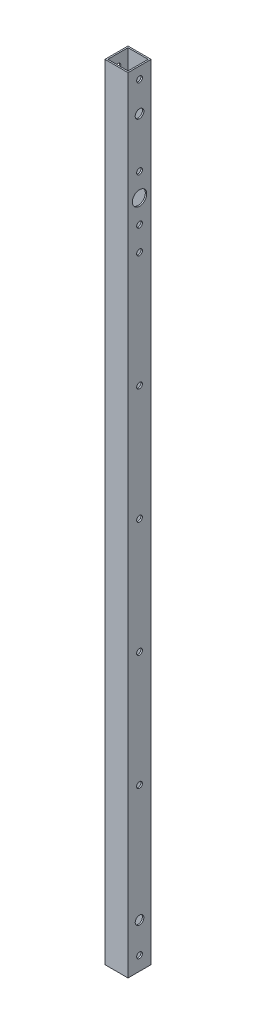
ISO-10303-21;
HEADER;
FILE_DESCRIPTION(('STEP AP214'),'2;1');
FILE_NAME('part.step','',(''),(''),'','','');
FILE_SCHEMA(('AUTOMOTIVE_DESIGN { 1 0 10303 214 1 1 1 1 }'));
ENDSEC;
DATA;
#1=APPLICATION_CONTEXT('core data for automotive mechanical design processes');
#2=APPLICATION_PROTOCOL_DEFINITION('international standard','automotive_design',2000,#1);
#3=PRODUCT_CONTEXT('',#1,'mechanical');
#4=PRODUCT('Part','Part','',(#3));
#5=PRODUCT_RELATED_PRODUCT_CATEGORY('part','',(#4));
#6=PRODUCT_DEFINITION_FORMATION('','',#4);
#7=PRODUCT_DEFINITION_CONTEXT('part definition',#1,'design');
#8=PRODUCT_DEFINITION('design','',#6,#7);
#9=PRODUCT_DEFINITION_SHAPE('','',#8);
#10=(LENGTH_UNIT() NAMED_UNIT(*) SI_UNIT(.MILLI.,.METRE.));
#11=(NAMED_UNIT(*) PLANE_ANGLE_UNIT() SI_UNIT($,.RADIAN.));
#12=(NAMED_UNIT(*) SI_UNIT($,.STERADIAN.) SOLID_ANGLE_UNIT());
#13=UNCERTAINTY_MEASURE_WITH_UNIT(LENGTH_MEASURE(1.E-05),#10,'distance_accuracy_value','');
#14=(GEOMETRIC_REPRESENTATION_CONTEXT(3) GLOBAL_UNCERTAINTY_ASSIGNED_CONTEXT((#13)) GLOBAL_UNIT_ASSIGNED_CONTEXT((#10,
#11,#12)) REPRESENTATION_CONTEXT('',''));
#15=CARTESIAN_POINT('',(0.,0.,0.));
#16=DIRECTION('',(0.,0.,1.));
#17=DIRECTION('',(1.,0.,0.));
#18=AXIS2_PLACEMENT_3D('',#15,#16,#17);
#19=CARTESIAN_POINT('',(0.,863.6,0.));
#20=DIRECTION('',(0.,-1.,0.));
#21=DIRECTION('',(0.,0.,-1.));
#22=AXIS2_PLACEMENT_3D('',#19,#20,#21);
#23=PLANE('',#22);
#24=DIRECTION('',(0.,0.,-1.));
#25=VECTOR('',#24,1.);
#26=CARTESIAN_POINT('',(12.7,863.6,12.7));
#27=LINE('',#26,#25);
#28=CARTESIAN_POINT('',(12.7,863.6,12.7));
#29=VERTEX_POINT('',#28);
#30=CARTESIAN_POINT('',(12.7,863.6,-12.7));
#31=VERTEX_POINT('',#30);
#32=EDGE_CURVE('E156',#29,#31,#27,.T.);
#33=ORIENTED_EDGE('',*,*,#32,.T.);
#34=DIRECTION('',(-1.,0.,0.));
#35=VECTOR('',#34,1.);
#36=CARTESIAN_POINT('',(-12.7,863.6,-12.7));
#37=LINE('',#36,#35);
#38=CARTESIAN_POINT('',(-12.7,863.6,-12.7));
#39=VERTEX_POINT('',#38);
#40=EDGE_CURVE('E160',#31,#39,#37,.T.);
#41=ORIENTED_EDGE('',*,*,#40,.T.);
#42=DIRECTION('',(0.,0.,1.));
#43=VECTOR('',#42,1.);
#44=CARTESIAN_POINT('',(-12.7,863.6,12.7));
#45=LINE('',#44,#43);
#46=CARTESIAN_POINT('',(-12.7,863.6,12.7));
#47=VERTEX_POINT('',#46);
#48=EDGE_CURVE('E164',#39,#47,#45,.T.);
#49=ORIENTED_EDGE('',*,*,#48,.T.);
#50=DIRECTION('',(1.,0.,0.));
#51=VECTOR('',#50,1.);
#52=CARTESIAN_POINT('',(-12.7,863.6,12.7));
#53=LINE('',#52,#51);
#54=EDGE_CURVE('E167',#47,#29,#53,.T.);
#55=ORIENTED_EDGE('',*,*,#54,.T.);
#56=EDGE_LOOP('',(#33,#41,#49,#55));
#57=FACE_BOUND('',#56,.T.);
#58=DIRECTION('',(0.,0.,-1.));
#59=VECTOR('',#58,1.);
#60=CARTESIAN_POINT('',(11.1125,863.6,11.1125));
#61=LINE('',#60,#59);
#62=CARTESIAN_POINT('',(11.1125,863.6,11.1125));
#63=VERTEX_POINT('',#62);
#64=CARTESIAN_POINT('',(11.1125,863.6,-11.1125));
#65=VERTEX_POINT('',#64);
#66=EDGE_CURVE('E106',#63,#65,#61,.T.);
#67=ORIENTED_EDGE('',*,*,#66,.F.);
#68=DIRECTION('',(1.,0.,0.));
#69=VECTOR('',#68,1.);
#70=CARTESIAN_POINT('',(-11.1125,863.6,11.1125));
#71=LINE('',#70,#69);
#72=CARTESIAN_POINT('',(-11.1125,863.6,11.1125));
#73=VERTEX_POINT('',#72);
#74=EDGE_CURVE('E132',#73,#63,#71,.T.);
#75=ORIENTED_EDGE('',*,*,#74,.F.);
#76=DIRECTION('',(0.,0.,1.));
#77=VECTOR('',#76,1.);
#78=CARTESIAN_POINT('',(-11.1125,863.6,11.1125));
#79=LINE('',#78,#77);
#80=CARTESIAN_POINT('',(-11.1125,863.6,-11.1125));
#81=VERTEX_POINT('',#80);
#82=EDGE_CURVE('E128',#81,#73,#79,.T.);
#83=ORIENTED_EDGE('',*,*,#82,.F.);
#84=DIRECTION('',(-1.,0.,0.));
#85=VECTOR('',#84,1.);
#86=CARTESIAN_POINT('',(-11.1125,863.6,-11.1125));
#87=LINE('',#86,#85);
#88=EDGE_CURVE('E115',#65,#81,#87,.T.);
#89=ORIENTED_EDGE('',*,*,#88,.F.);
#90=EDGE_LOOP('',(#67,#75,#83,#89));
#91=FACE_BOUND('',#90,.T.);
#92=ADVANCED_FACE('F38',(#57,#91),#23,.F.);
#93=CARTESIAN_POINT('',(0.,0.,0.));
#94=DIRECTION('',(0.,-1.,0.));
#95=DIRECTION('',(0.,0.,-1.));
#96=AXIS2_PLACEMENT_3D('',#93,#94,#95);
#97=PLANE('',#96);
#98=DIRECTION('',(0.,0.,-1.));
#99=VECTOR('',#98,1.);
#100=CARTESIAN_POINT('',(12.7,0.,12.7));
#101=LINE('',#100,#99);
#102=CARTESIAN_POINT('',(12.7,0.,12.7));
#103=VERTEX_POINT('',#102);
#104=CARTESIAN_POINT('',(12.7,0.,-12.7));
#105=VERTEX_POINT('',#104);
#106=EDGE_CURVE('E124',#103,#105,#101,.T.);
#107=ORIENTED_EDGE('',*,*,#106,.F.);
#108=DIRECTION('',(1.,0.,0.));
#109=VECTOR('',#108,1.);
#110=CARTESIAN_POINT('',(-12.7,0.,12.7));
#111=LINE('',#110,#109);
#112=CARTESIAN_POINT('',(-12.7,0.,12.7));
#113=VERTEX_POINT('',#112);
#114=EDGE_CURVE('E161',#113,#103,#111,.T.);
#115=ORIENTED_EDGE('',*,*,#114,.F.);
#116=DIRECTION('',(0.,0.,1.));
#117=VECTOR('',#116,1.);
#118=CARTESIAN_POINT('',(-12.7,0.,12.7));
#119=LINE('',#118,#117);
#120=CARTESIAN_POINT('',(-12.7,0.,-12.7));
#121=VERTEX_POINT('',#120);
#122=EDGE_CURVE('E177',#121,#113,#119,.T.);
#123=ORIENTED_EDGE('',*,*,#122,.F.);
#124=DIRECTION('',(-1.,0.,0.));
#125=VECTOR('',#124,1.);
#126=CARTESIAN_POINT('',(-12.7,0.,-12.7));
#127=LINE('',#126,#125);
#128=EDGE_CURVE('E174',#105,#121,#127,.T.);
#129=ORIENTED_EDGE('',*,*,#128,.F.);
#130=EDGE_LOOP('',(#107,#115,#123,#129));
#131=FACE_BOUND('',#130,.T.);
#132=DIRECTION('',(1.,0.,0.));
#133=VECTOR('',#132,1.);
#134=CARTESIAN_POINT('',(-11.1125,0.,11.1125));
#135=LINE('',#134,#133);
#136=CARTESIAN_POINT('',(-11.1125,0.,11.1125));
#137=VERTEX_POINT('',#136);
#138=CARTESIAN_POINT('',(11.1125,0.,11.1125));
#139=VERTEX_POINT('',#138);
#140=EDGE_CURVE('E116',#137,#139,#135,.T.);
#141=ORIENTED_EDGE('',*,*,#140,.T.);
#142=DIRECTION('',(0.,0.,-1.));
#143=VECTOR('',#142,1.);
#144=CARTESIAN_POINT('',(11.1125,0.,11.1125));
#145=LINE('',#144,#143);
#146=CARTESIAN_POINT('',(11.1125,0.,-11.1125));
#147=VERTEX_POINT('',#146);
#148=EDGE_CURVE('E64',#139,#147,#145,.T.);
#149=ORIENTED_EDGE('',*,*,#148,.T.);
#150=DIRECTION('',(-1.,0.,0.));
#151=VECTOR('',#150,1.);
#152=CARTESIAN_POINT('',(-11.1125,0.,-11.1125));
#153=LINE('',#152,#151);
#154=CARTESIAN_POINT('',(-11.1125,0.,-11.1125));
#155=VERTEX_POINT('',#154);
#156=EDGE_CURVE('E122',#147,#155,#153,.T.);
#157=ORIENTED_EDGE('',*,*,#156,.T.);
#158=DIRECTION('',(0.,0.,1.));
#159=VECTOR('',#158,1.);
#160=CARTESIAN_POINT('',(-11.1125,0.,11.1125));
#161=LINE('',#160,#159);
#162=EDGE_CURVE('E143',#155,#137,#161,.T.);
#163=ORIENTED_EDGE('',*,*,#162,.T.);
#164=EDGE_LOOP('',(#141,#149,#157,#163));
#165=FACE_BOUND('',#164,.T.);
#166=ADVANCED_FACE('F394',(#131,#165),#97,.T.);
#167=CARTESIAN_POINT('',(12.7,863.6,12.7));
#168=DIRECTION('',(-1.,0.,0.));
#169=DIRECTION('',(0.,0.,1.));
#170=AXIS2_PLACEMENT_3D('',#167,#168,#169);
#171=PLANE('',#170);
#172=CARTESIAN_POINT('',(12.7,763.110800359025,0.));
#173=DIRECTION('',(1.,0.,0.));
#174=DIRECTION('',(0.,0.,-1.));
#175=AXIS2_PLACEMENT_3D('',#172,#173,#174);
#176=CIRCLE('',#175,3.17500000000004);
#177=CARTESIAN_POINT('',(12.7,763.110800359025,-3.17500000000004));
#178=VERTEX_POINT('',#177);
#179=EDGE_CURVE('E502',#178,#178,#176,.T.);
#180=ORIENTED_EDGE('',*,*,#179,.F.);
#181=EDGE_LOOP('',(#180));
#182=FACE_BOUND('',#181,.T.);
#183=CARTESIAN_POINT('',(12.7,712.310800359025,0.));
#184=DIRECTION('',(1.,0.,0.));
#185=DIRECTION('',(0.,0.,-1.));
#186=AXIS2_PLACEMENT_3D('',#183,#184,#185);
#187=CIRCLE('',#186,3.17500000000004);
#188=CARTESIAN_POINT('',(12.7,712.310800359025,-3.17500000000004));
#189=VERTEX_POINT('',#188);
#190=EDGE_CURVE('E246',#189,#189,#187,.T.);
#191=ORIENTED_EDGE('',*,*,#190,.F.);
#192=EDGE_LOOP('',(#191));
#193=FACE_BOUND('',#192,.T.);
#194=CARTESIAN_POINT('',(12.7,737.710800359025,0.));
#195=DIRECTION('',(1.,0.,0.));
#196=DIRECTION('',(0.,0.,-1.));
#197=AXIS2_PLACEMENT_3D('',#194,#195,#196);
#198=CIRCLE('',#197,7.93750000000004);
#199=CARTESIAN_POINT('',(12.7,737.710800359025,-7.93750000000004));
#200=VERTEX_POINT('',#199);
#201=EDGE_CURVE('E243',#200,#200,#198,.T.);
#202=ORIENTED_EDGE('',*,*,#201,.F.);
#203=EDGE_LOOP('',(#202));
#204=FACE_BOUND('',#203,.T.);
#205=CARTESIAN_POINT('',(12.7,818.044974990033,0.));
#206=DIRECTION('',(1.,0.,0.));
#207=DIRECTION('',(0.,0.,-1.));
#208=AXIS2_PLACEMENT_3D('',#205,#206,#207);
#209=CIRCLE('',#208,4.7625);
#210=CARTESIAN_POINT('',(12.7,818.044974990033,-4.7625));
#211=VERTEX_POINT('',#210);
#212=EDGE_CURVE('E265',#211,#211,#209,.T.);
#213=ORIENTED_EDGE('',*,*,#212,.F.);
#214=EDGE_LOOP('',(#213));
#215=FACE_BOUND('',#214,.T.);
#216=CARTESIAN_POINT('',(12.7,48.9005700649443,0.));
#217=DIRECTION('',(1.,0.,0.));
#218=DIRECTION('',(0.,0.,-1.));
#219=AXIS2_PLACEMENT_3D('',#216,#217,#218);
#220=CIRCLE('',#219,4.7625);
#221=CARTESIAN_POINT('',(12.7,48.9005700649443,-4.76249999999999));
#222=VERTEX_POINT('',#221);
#223=EDGE_CURVE('E281',#222,#222,#220,.T.);
#224=ORIENTED_EDGE('',*,*,#223,.F.);
#225=EDGE_LOOP('',(#224));
#226=FACE_BOUND('',#225,.T.);
#227=CARTESIAN_POINT('',(12.7,850.9,0.));
#228=DIRECTION('',(1.,0.,0.));
#229=DIRECTION('',(0.,0.,-1.));
#230=AXIS2_PLACEMENT_3D('',#227,#228,#229);
#231=CIRCLE('',#230,3.17500000000004);
#232=CARTESIAN_POINT('',(12.7,850.9,-3.17500000000004));
#233=VERTEX_POINT('',#232);
#234=EDGE_CURVE('E291',#233,#233,#231,.T.);
#235=ORIENTED_EDGE('',*,*,#234,.F.);
#236=EDGE_LOOP('',(#235));
#237=FACE_BOUND('',#236,.T.);
#238=CARTESIAN_POINT('',(12.7,15.3982824673544,0.));
#239=DIRECTION('',(1.,0.,0.));
#240=DIRECTION('',(0.,0.,-1.));
#241=AXIS2_PLACEMENT_3D('',#238,#239,#240);
#242=CIRCLE('',#241,3.17499999999999);
#243=CARTESIAN_POINT('',(12.7,15.3982824673544,-3.17499999999999));
#244=VERTEX_POINT('',#243);
#245=EDGE_CURVE('E307',#244,#244,#242,.T.);
#246=ORIENTED_EDGE('',*,*,#245,.F.);
#247=EDGE_LOOP('',(#246));
#248=FACE_BOUND('',#247,.T.);
#249=CARTESIAN_POINT('',(12.7,431.8,0.));
#250=DIRECTION('',(1.,0.,0.));
#251=DIRECTION('',(0.,0.,-1.));
#252=AXIS2_PLACEMENT_3D('',#249,#250,#251);
#253=CIRCLE('',#252,3.17499999999998);
#254=CARTESIAN_POINT('',(12.7,431.8,-3.17499999999998));
#255=VERTEX_POINT('',#254);
#256=EDGE_CURVE('E317',#255,#255,#253,.T.);
#257=ORIENTED_EDGE('',*,*,#256,.F.);
#258=EDGE_LOOP('',(#257));
#259=FACE_BOUND('',#258,.T.);
#260=CARTESIAN_POINT('',(12.7,558.8,0.));
#261=DIRECTION('',(1.,0.,0.));
#262=DIRECTION('',(0.,0.,-1.));
#263=AXIS2_PLACEMENT_3D('',#260,#261,#262);
#264=CIRCLE('',#263,3.17500000000004);
#265=CARTESIAN_POINT('',(12.7,558.8,-3.17500000000008));
#266=VERTEX_POINT('',#265);
#267=EDGE_CURVE('E327',#266,#266,#264,.T.);
#268=ORIENTED_EDGE('',*,*,#267,.F.);
#269=EDGE_LOOP('',(#268));
#270=FACE_BOUND('',#269,.T.);
#271=CARTESIAN_POINT('',(12.7,685.8,0.));
#272=DIRECTION('',(1.,0.,0.));
#273=DIRECTION('',(0.,0.,-1.));
#274=AXIS2_PLACEMENT_3D('',#271,#272,#273);
#275=CIRCLE('',#274,3.17500000000004);
#276=CARTESIAN_POINT('',(12.7,685.8,-3.17500000000006));
#277=VERTEX_POINT('',#276);
#278=EDGE_CURVE('E337',#277,#277,#275,.T.);
#279=ORIENTED_EDGE('',*,*,#278,.F.);
#280=EDGE_LOOP('',(#279));
#281=FACE_BOUND('',#280,.T.);
#282=CARTESIAN_POINT('',(12.7,304.8,0.));
#283=DIRECTION('',(1.,0.,0.));
#284=DIRECTION('',(0.,0.,-1.));
#285=AXIS2_PLACEMENT_3D('',#282,#283,#284);
#286=CIRCLE('',#285,3.17499999999998);
#287=CARTESIAN_POINT('',(12.7,304.8,-3.17500000000005));
#288=VERTEX_POINT('',#287);
#289=EDGE_CURVE('E347',#288,#288,#286,.T.);
#290=ORIENTED_EDGE('',*,*,#289,.F.);
#291=EDGE_LOOP('',(#290));
#292=FACE_BOUND('',#291,.T.);
#293=CARTESIAN_POINT('',(12.7,177.8,0.));
#294=DIRECTION('',(1.,0.,0.));
#295=DIRECTION('',(0.,0.,-1.));
#296=AXIS2_PLACEMENT_3D('',#293,#294,#295);
#297=CIRCLE('',#296,3.17499999999998);
#298=CARTESIAN_POINT('',(12.7,177.8,-3.17500000000007));
#299=VERTEX_POINT('',#298);
#300=EDGE_CURVE('E357',#299,#299,#297,.T.);
#301=ORIENTED_EDGE('',*,*,#300,.F.);
#302=EDGE_LOOP('',(#301));
#303=FACE_BOUND('',#302,.T.);
#304=ORIENTED_EDGE('',*,*,#106,.T.);
#305=DIRECTION('',(0.,-1.,0.));
#306=VECTOR('',#305,1.);
#307=CARTESIAN_POINT('',(12.7,863.6,-12.7));
#308=LINE('',#307,#306);
#309=EDGE_CURVE('E11',#31,#105,#308,.T.);
#310=ORIENTED_EDGE('',*,*,#309,.F.);
#311=ORIENTED_EDGE('',*,*,#32,.F.);
#312=DIRECTION('',(0.,-1.,0.));
#313=VECTOR('',#312,1.);
#314=CARTESIAN_POINT('',(12.7,863.6,12.7));
#315=LINE('',#314,#313);
#316=EDGE_CURVE('E170',#29,#103,#315,.T.);
#317=ORIENTED_EDGE('',*,*,#316,.T.);
#318=EDGE_LOOP('',(#304,#310,#311,#317));
#319=FACE_BOUND('',#318,.T.);
#320=ADVANCED_FACE('F40',(#182,#193,#204,#215,#226,#237,#248,#259,#270,#281,#292,#303,#319),
#171,.F.);
#321=CARTESIAN_POINT('',(-12.7,863.6,-12.7));
#322=DIRECTION('',(0.,0.,1.));
#323=DIRECTION('',(1.,0.,0.));
#324=AXIS2_PLACEMENT_3D('',#321,#322,#323);
#325=PLANE('',#324);
#326=ORIENTED_EDGE('',*,*,#128,.T.);
#327=DIRECTION('',(0.,-1.,0.));
#328=VECTOR('',#327,1.);
#329=CARTESIAN_POINT('',(-12.7,863.6,-12.7));
#330=LINE('',#329,#328);
#331=EDGE_CURVE('E48',#39,#121,#330,.T.);
#332=ORIENTED_EDGE('',*,*,#331,.F.);
#333=ORIENTED_EDGE('',*,*,#40,.F.);
#334=ORIENTED_EDGE('',*,*,#309,.T.);
#335=EDGE_LOOP('',(#326,#332,#333,#334));
#336=FACE_BOUND('',#335,.T.);
#337=ADVANCED_FACE('F402',(#336),#325,.F.);
#338=CARTESIAN_POINT('',(-12.7,863.6,12.7));
#339=DIRECTION('',(1.,0.,0.));
#340=DIRECTION('',(0.,0.,-1.));
#341=AXIS2_PLACEMENT_3D('',#338,#339,#340);
#342=PLANE('',#341);
#343=CARTESIAN_POINT('',(-12.7,763.110800359025,0.));
#344=DIRECTION('',(1.,0.,0.));
#345=DIRECTION('',(0.,0.,-1.));
#346=AXIS2_PLACEMENT_3D('',#343,#344,#345);
#347=CIRCLE('',#346,3.17500000000004);
#348=CARTESIAN_POINT('',(-12.7,763.110800359025,-3.17500000000004));
#349=VERTEX_POINT('',#348);
#350=EDGE_CURVE('E504',#349,#349,#347,.T.);
#351=ORIENTED_EDGE('',*,*,#350,.T.);
#352=EDGE_LOOP('',(#351));
#353=FACE_BOUND('',#352,.T.);
#354=CARTESIAN_POINT('',(-12.7,712.310800359025,0.));
#355=DIRECTION('',(1.,0.,0.));
#356=DIRECTION('',(0.,0.,-1.));
#357=AXIS2_PLACEMENT_3D('',#354,#355,#356);
#358=CIRCLE('',#357,3.17500000000004);
#359=CARTESIAN_POINT('',(-12.7,712.310800359025,-3.17500000000004));
#360=VERTEX_POINT('',#359);
#361=EDGE_CURVE('E237',#360,#360,#358,.T.);
#362=ORIENTED_EDGE('',*,*,#361,.T.);
#363=EDGE_LOOP('',(#362));
#364=FACE_BOUND('',#363,.T.);
#365=CARTESIAN_POINT('',(-12.7,737.710800359025,0.));
#366=DIRECTION('',(1.,0.,0.));
#367=DIRECTION('',(0.,0.,-1.));
#368=AXIS2_PLACEMENT_3D('',#365,#366,#367);
#369=CIRCLE('',#368,7.93750000000004);
#370=CARTESIAN_POINT('',(-12.7,737.710800359025,-7.93750000000004));
#371=VERTEX_POINT('',#370);
#372=EDGE_CURVE('E232',#371,#371,#369,.T.);
#373=ORIENTED_EDGE('',*,*,#372,.T.);
#374=EDGE_LOOP('',(#373));
#375=FACE_BOUND('',#374,.T.);
#376=CARTESIAN_POINT('',(-12.7,818.044974990033,0.));
#377=DIRECTION('',(1.,0.,0.));
#378=DIRECTION('',(0.,0.,-1.));
#379=AXIS2_PLACEMENT_3D('',#376,#377,#378);
#380=CIRCLE('',#379,4.7625);
#381=CARTESIAN_POINT('',(-12.7,818.044974990033,-4.7625));
#382=VERTEX_POINT('',#381);
#383=EDGE_CURVE('E269',#382,#382,#380,.T.);
#384=ORIENTED_EDGE('',*,*,#383,.T.);
#385=EDGE_LOOP('',(#384));
#386=FACE_BOUND('',#385,.T.);
#387=CARTESIAN_POINT('',(-12.7,48.9005700649443,0.));
#388=DIRECTION('',(1.,0.,0.));
#389=DIRECTION('',(0.,0.,-1.));
#390=AXIS2_PLACEMENT_3D('',#387,#388,#389);
#391=CIRCLE('',#390,4.7625);
#392=CARTESIAN_POINT('',(-12.7,48.9005700649443,-4.76249999999999));
#393=VERTEX_POINT('',#392);
#394=EDGE_CURVE('E227',#393,#393,#391,.T.);
#395=ORIENTED_EDGE('',*,*,#394,.T.);
#396=EDGE_LOOP('',(#395));
#397=FACE_BOUND('',#396,.T.);
#398=CARTESIAN_POINT('',(-12.7,850.9,0.));
#399=DIRECTION('',(1.,0.,0.));
#400=DIRECTION('',(0.,0.,-1.));
#401=AXIS2_PLACEMENT_3D('',#398,#399,#400);
#402=CIRCLE('',#401,3.17500000000004);
#403=CARTESIAN_POINT('',(-12.7,850.9,-3.17500000000004));
#404=VERTEX_POINT('',#403);
#405=EDGE_CURVE('E295',#404,#404,#402,.T.);
#406=ORIENTED_EDGE('',*,*,#405,.T.);
#407=EDGE_LOOP('',(#406));
#408=FACE_BOUND('',#407,.T.);
#409=CARTESIAN_POINT('',(-12.7,15.3982824673544,0.));
#410=DIRECTION('',(1.,0.,0.));
#411=DIRECTION('',(0.,0.,-1.));
#412=AXIS2_PLACEMENT_3D('',#409,#410,#411);
#413=CIRCLE('',#412,3.17499999999999);
#414=CARTESIAN_POINT('',(-12.7,15.3982824673544,-3.17499999999998));
#415=VERTEX_POINT('',#414);
#416=EDGE_CURVE('E221',#415,#415,#413,.T.);
#417=ORIENTED_EDGE('',*,*,#416,.T.);
#418=EDGE_LOOP('',(#417));
#419=FACE_BOUND('',#418,.T.);
#420=CARTESIAN_POINT('',(-12.7,431.8,0.));
#421=DIRECTION('',(1.,0.,0.));
#422=DIRECTION('',(0.,0.,-1.));
#423=AXIS2_PLACEMENT_3D('',#420,#421,#422);
#424=CIRCLE('',#423,3.17499999999998);
#425=CARTESIAN_POINT('',(-12.7,431.8,-3.17499999999998));
#426=VERTEX_POINT('',#425);
#427=EDGE_CURVE('E215',#426,#426,#424,.T.);
#428=ORIENTED_EDGE('',*,*,#427,.T.);
#429=EDGE_LOOP('',(#428));
#430=FACE_BOUND('',#429,.T.);
#431=CARTESIAN_POINT('',(-12.7,558.8,0.));
#432=DIRECTION('',(1.,0.,0.));
#433=DIRECTION('',(0.,0.,-1.));
#434=AXIS2_PLACEMENT_3D('',#431,#432,#433);
#435=CIRCLE('',#434,3.17500000000004);
#436=CARTESIAN_POINT('',(-12.7,558.8,-3.17500000000007));
#437=VERTEX_POINT('',#436);
#438=EDGE_CURVE('E209',#437,#437,#435,.T.);
#439=ORIENTED_EDGE('',*,*,#438,.T.);
#440=EDGE_LOOP('',(#439));
#441=FACE_BOUND('',#440,.T.);
#442=CARTESIAN_POINT('',(-12.7,685.8,0.));
#443=DIRECTION('',(1.,0.,0.));
#444=DIRECTION('',(0.,0.,-1.));
#445=AXIS2_PLACEMENT_3D('',#442,#443,#444);
#446=CIRCLE('',#445,3.17500000000004);
#447=CARTESIAN_POINT('',(-12.7,685.8,-3.17500000000006));
#448=VERTEX_POINT('',#447);
#449=EDGE_CURVE('E203',#448,#448,#446,.T.);
#450=ORIENTED_EDGE('',*,*,#449,.T.);
#451=EDGE_LOOP('',(#450));
#452=FACE_BOUND('',#451,.T.);
#453=CARTESIAN_POINT('',(-12.7,304.8,0.));
#454=DIRECTION('',(1.,0.,0.));
#455=DIRECTION('',(0.,0.,-1.));
#456=AXIS2_PLACEMENT_3D('',#453,#454,#455);
#457=CIRCLE('',#456,3.17499999999998);
#458=CARTESIAN_POINT('',(-12.7,304.8,-3.17500000000005));
#459=VERTEX_POINT('',#458);
#460=EDGE_CURVE('E197',#459,#459,#457,.T.);
#461=ORIENTED_EDGE('',*,*,#460,.T.);
#462=EDGE_LOOP('',(#461));
#463=FACE_BOUND('',#462,.T.);
#464=CARTESIAN_POINT('',(-12.7,177.8,0.));
#465=DIRECTION('',(1.,0.,0.));
#466=DIRECTION('',(0.,0.,-1.));
#467=AXIS2_PLACEMENT_3D('',#464,#465,#466);
#468=CIRCLE('',#467,3.17499999999998);
#469=CARTESIAN_POINT('',(-12.7,177.8,-3.17500000000007));
#470=VERTEX_POINT('',#469);
#471=EDGE_CURVE('E361',#470,#470,#468,.T.);
#472=ORIENTED_EDGE('',*,*,#471,.T.);
#473=EDGE_LOOP('',(#472));
#474=FACE_BOUND('',#473,.T.);
#475=ORIENTED_EDGE('',*,*,#122,.T.);
#476=DIRECTION('',(0.,-1.,0.));
#477=VECTOR('',#476,1.);
#478=CARTESIAN_POINT('',(-12.7,863.6,12.7));
#479=LINE('',#478,#477);
#480=EDGE_CURVE('E185',#47,#113,#479,.T.);
#481=ORIENTED_EDGE('',*,*,#480,.F.);
#482=ORIENTED_EDGE('',*,*,#48,.F.);
#483=ORIENTED_EDGE('',*,*,#331,.T.);
#484=EDGE_LOOP('',(#475,#481,#482,#483));
#485=FACE_BOUND('',#484,.T.);
#486=ADVANCED_FACE('F387',(#353,#364,#375,#386,#397,#408,#419,#430,#441,#452,#463,#474,#485),
#342,.F.);
#487=CARTESIAN_POINT('',(-12.7,863.6,12.7));
#488=DIRECTION('',(0.,0.,-1.));
#489=DIRECTION('',(-1.,0.,0.));
#490=AXIS2_PLACEMENT_3D('',#487,#488,#489);
#491=PLANE('',#490);
#492=ORIENTED_EDGE('',*,*,#114,.T.);
#493=ORIENTED_EDGE('',*,*,#316,.F.);
#494=ORIENTED_EDGE('',*,*,#54,.F.);
#495=ORIENTED_EDGE('',*,*,#480,.T.);
#496=EDGE_LOOP('',(#492,#493,#494,#495));
#497=FACE_BOUND('',#496,.T.);
#498=ADVANCED_FACE('F376',(#497),#491,.F.);
#499=CARTESIAN_POINT('',(11.1125,863.6,11.1125));
#500=DIRECTION('',(-1.,0.,0.));
#501=DIRECTION('',(0.,0.,1.));
#502=AXIS2_PLACEMENT_3D('',#499,#500,#501);
#503=PLANE('',#502);
#504=CARTESIAN_POINT('',(11.1125,763.110800359025,0.));
#505=DIRECTION('',(-1.,0.,0.));
#506=DIRECTION('',(0.,0.,1.));
#507=AXIS2_PLACEMENT_3D('',#504,#505,#506);
#508=CIRCLE('',#507,3.17500000000004);
#509=CARTESIAN_POINT('',(11.1125,763.110800359025,3.17500000000004));
#510=VERTEX_POINT('',#509);
#511=EDGE_CURVE('E42',#510,#510,#508,.T.);
#512=ORIENTED_EDGE('',*,*,#511,.F.);
#513=EDGE_LOOP('',(#512));
#514=FACE_BOUND('',#513,.T.);
#515=CARTESIAN_POINT('',(11.1125,712.310800359025,0.));
#516=DIRECTION('',(-1.,0.,0.));
#517=DIRECTION('',(0.,0.,1.));
#518=AXIS2_PLACEMENT_3D('',#515,#516,#517);
#519=CIRCLE('',#518,3.17500000000004);
#520=CARTESIAN_POINT('',(11.1125,712.310800359025,3.17500000000004));
#521=VERTEX_POINT('',#520);
#522=EDGE_CURVE('E233',#521,#521,#519,.T.);
#523=ORIENTED_EDGE('',*,*,#522,.F.);
#524=EDGE_LOOP('',(#523));
#525=FACE_BOUND('',#524,.T.);
#526=CARTESIAN_POINT('',(11.1125,737.710800359025,0.));
#527=DIRECTION('',(-1.,0.,0.));
#528=DIRECTION('',(0.,0.,1.));
#529=AXIS2_PLACEMENT_3D('',#526,#527,#528);
#530=CIRCLE('',#529,7.93750000000004);
#531=CARTESIAN_POINT('',(11.1125,737.710800359025,7.93750000000004));
#532=VERTEX_POINT('',#531);
#533=EDGE_CURVE('E228',#532,#532,#530,.T.);
#534=ORIENTED_EDGE('',*,*,#533,.F.);
#535=EDGE_LOOP('',(#534));
#536=FACE_BOUND('',#535,.T.);
#537=CARTESIAN_POINT('',(11.1125,818.044974990033,0.));
#538=DIRECTION('',(-1.,0.,0.));
#539=DIRECTION('',(0.,0.,1.));
#540=AXIS2_PLACEMENT_3D('',#537,#538,#539);
#541=CIRCLE('',#540,4.7625);
#542=CARTESIAN_POINT('',(11.1125,818.044974990033,4.7625));
#543=VERTEX_POINT('',#542);
#544=EDGE_CURVE('E273',#543,#543,#541,.T.);
#545=ORIENTED_EDGE('',*,*,#544,.F.);
#546=EDGE_LOOP('',(#545));
#547=FACE_BOUND('',#546,.T.);
#548=CARTESIAN_POINT('',(11.1125,48.9005700649443,0.));
#549=DIRECTION('',(-1.,0.,0.));
#550=DIRECTION('',(0.,0.,1.));
#551=AXIS2_PLACEMENT_3D('',#548,#549,#550);
#552=CIRCLE('',#551,4.7625);
#553=CARTESIAN_POINT('',(11.1125,48.9005700649443,4.7625));
#554=VERTEX_POINT('',#553);
#555=EDGE_CURVE('E226',#554,#554,#552,.T.);
#556=ORIENTED_EDGE('',*,*,#555,.F.);
#557=EDGE_LOOP('',(#556));
#558=FACE_BOUND('',#557,.T.);
#559=CARTESIAN_POINT('',(11.1125,850.9,0.));
#560=DIRECTION('',(-1.,0.,0.));
#561=DIRECTION('',(0.,0.,1.));
#562=AXIS2_PLACEMENT_3D('',#559,#560,#561);
#563=CIRCLE('',#562,3.17500000000004);
#564=CARTESIAN_POINT('',(11.1125,850.9,3.17500000000004));
#565=VERTEX_POINT('',#564);
#566=EDGE_CURVE('E299',#565,#565,#563,.T.);
#567=ORIENTED_EDGE('',*,*,#566,.F.);
#568=EDGE_LOOP('',(#567));
#569=FACE_BOUND('',#568,.T.);
#570=CARTESIAN_POINT('',(11.1125,15.3982824673544,0.));
#571=DIRECTION('',(-1.,0.,0.));
#572=DIRECTION('',(0.,0.,1.));
#573=AXIS2_PLACEMENT_3D('',#570,#571,#572);
#574=CIRCLE('',#573,3.17499999999999);
#575=CARTESIAN_POINT('',(11.1125,15.3982824673544,3.17499999999999));
#576=VERTEX_POINT('',#575);
#577=EDGE_CURVE('E220',#576,#576,#574,.T.);
#578=ORIENTED_EDGE('',*,*,#577,.F.);
#579=EDGE_LOOP('',(#578));
#580=FACE_BOUND('',#579,.T.);
#581=CARTESIAN_POINT('',(11.1125,431.8,0.));
#582=DIRECTION('',(-1.,0.,0.));
#583=DIRECTION('',(0.,0.,1.));
#584=AXIS2_PLACEMENT_3D('',#581,#582,#583);
#585=CIRCLE('',#584,3.17499999999998);
#586=CARTESIAN_POINT('',(11.1125,431.8,3.17499999999998));
#587=VERTEX_POINT('',#586);
#588=EDGE_CURVE('E214',#587,#587,#585,.T.);
#589=ORIENTED_EDGE('',*,*,#588,.F.);
#590=EDGE_LOOP('',(#589));
#591=FACE_BOUND('',#590,.T.);
#592=CARTESIAN_POINT('',(11.1125,558.8,0.));
#593=DIRECTION('',(-1.,0.,0.));
#594=DIRECTION('',(0.,0.,1.));
#595=AXIS2_PLACEMENT_3D('',#592,#593,#594);
#596=CIRCLE('',#595,3.17500000000004);
#597=CARTESIAN_POINT('',(11.1125,558.8,3.175));
#598=VERTEX_POINT('',#597);
#599=EDGE_CURVE('E204',#598,#598,#596,.T.);
#600=ORIENTED_EDGE('',*,*,#599,.F.);
#601=EDGE_LOOP('',(#600));
#602=FACE_BOUND('',#601,.T.);
#603=CARTESIAN_POINT('',(11.1125,685.8,0.));
#604=DIRECTION('',(-1.,0.,0.));
#605=DIRECTION('',(0.,0.,1.));
#606=AXIS2_PLACEMENT_3D('',#603,#604,#605);
#607=CIRCLE('',#606,3.17500000000004);
#608=CARTESIAN_POINT('',(11.1125,685.8,3.17500000000002));
#609=VERTEX_POINT('',#608);
#610=EDGE_CURVE('E202',#609,#609,#607,.T.);
#611=ORIENTED_EDGE('',*,*,#610,.F.);
#612=EDGE_LOOP('',(#611));
#613=FACE_BOUND('',#612,.T.);
#614=CARTESIAN_POINT('',(11.1125,304.8,0.));
#615=DIRECTION('',(-1.,0.,0.));
#616=DIRECTION('',(0.,0.,1.));
#617=AXIS2_PLACEMENT_3D('',#614,#615,#616);
#618=CIRCLE('',#617,3.17499999999998);
#619=CARTESIAN_POINT('',(11.1125,304.8,3.17499999999991));
#620=VERTEX_POINT('',#619);
#621=EDGE_CURVE('E196',#620,#620,#618,.T.);
#622=ORIENTED_EDGE('',*,*,#621,.F.);
#623=EDGE_LOOP('',(#622));
#624=FACE_BOUND('',#623,.T.);
#625=CARTESIAN_POINT('',(11.1125,177.8,0.));
#626=DIRECTION('',(-1.,0.,0.));
#627=DIRECTION('',(0.,0.,1.));
#628=AXIS2_PLACEMENT_3D('',#625,#626,#627);
#629=CIRCLE('',#628,3.17499999999998);
#630=CARTESIAN_POINT('',(11.1125,177.8,3.1749999999999));
#631=VERTEX_POINT('',#630);
#632=EDGE_CURVE('E140',#631,#631,#629,.T.);
#633=ORIENTED_EDGE('',*,*,#632,.F.);
#634=EDGE_LOOP('',(#633));
#635=FACE_BOUND('',#634,.T.);
#636=ORIENTED_EDGE('',*,*,#148,.F.);
#637=DIRECTION('',(0.,-1.,0.));
#638=VECTOR('',#637,1.);
#639=CARTESIAN_POINT('',(11.1125,863.6,11.1125));
#640=LINE('',#639,#638);
#641=EDGE_CURVE('E110',#63,#139,#640,.T.);
#642=ORIENTED_EDGE('',*,*,#641,.F.);
#643=ORIENTED_EDGE('',*,*,#66,.T.);
#644=DIRECTION('',(0.,-1.,0.));
#645=VECTOR('',#644,1.);
#646=CARTESIAN_POINT('',(11.1125,863.6,-11.1125));
#647=LINE('',#646,#645);
#648=EDGE_CURVE('E109',#65,#147,#647,.T.);
#649=ORIENTED_EDGE('',*,*,#648,.T.);
#650=EDGE_LOOP('',(#636,#642,#643,#649));
#651=FACE_BOUND('',#650,.T.);
#652=ADVANCED_FACE('F108',(#514,#525,#536,#547,#558,#569,#580,#591,#602,#613,#624,#635,#651),
#503,.T.);
#653=CARTESIAN_POINT('',(-11.1125,863.6,-11.1125));
#654=DIRECTION('',(0.,0.,1.));
#655=DIRECTION('',(1.,0.,0.));
#656=AXIS2_PLACEMENT_3D('',#653,#654,#655);
#657=PLANE('',#656);
#658=ORIENTED_EDGE('',*,*,#156,.F.);
#659=ORIENTED_EDGE('',*,*,#648,.F.);
#660=ORIENTED_EDGE('',*,*,#88,.T.);
#661=DIRECTION('',(0.,-1.,0.));
#662=VECTOR('',#661,1.);
#663=CARTESIAN_POINT('',(-11.1125,863.6,-11.1125));
#664=LINE('',#663,#662);
#665=EDGE_CURVE('E125',#81,#155,#664,.T.);
#666=ORIENTED_EDGE('',*,*,#665,.T.);
#667=EDGE_LOOP('',(#658,#659,#660,#666));
#668=FACE_BOUND('',#667,.T.);
#669=ADVANCED_FACE('F119',(#668),#657,.T.);
#670=CARTESIAN_POINT('',(-11.1125,863.6,11.1125));
#671=DIRECTION('',(1.,0.,0.));
#672=DIRECTION('',(0.,0.,-1.));
#673=AXIS2_PLACEMENT_3D('',#670,#671,#672);
#674=PLANE('',#673);
#675=CARTESIAN_POINT('',(-11.1125,763.110800359025,0.));
#676=DIRECTION('',(1.,0.,0.));
#677=DIRECTION('',(0.,0.,-1.));
#678=AXIS2_PLACEMENT_3D('',#675,#676,#677);
#679=CIRCLE('',#678,3.17500000000004);
#680=CARTESIAN_POINT('',(-11.1125,763.110800359025,-3.17500000000004));
#681=VERTEX_POINT('',#680);
#682=EDGE_CURVE('E252',#681,#681,#679,.T.);
#683=ORIENTED_EDGE('',*,*,#682,.F.);
#684=EDGE_LOOP('',(#683));
#685=FACE_BOUND('',#684,.T.);
#686=CARTESIAN_POINT('',(-11.1125,712.310800359025,0.));
#687=DIRECTION('',(1.,0.,0.));
#688=DIRECTION('',(0.,0.,-1.));
#689=AXIS2_PLACEMENT_3D('',#686,#687,#688);
#690=CIRCLE('',#689,3.17500000000004);
#691=CARTESIAN_POINT('',(-11.1125,712.310800359025,-3.17500000000004));
#692=VERTEX_POINT('',#691);
#693=EDGE_CURVE('E236',#692,#692,#690,.T.);
#694=ORIENTED_EDGE('',*,*,#693,.F.);
#695=EDGE_LOOP('',(#694));
#696=FACE_BOUND('',#695,.T.);
#697=CARTESIAN_POINT('',(-11.1125,737.710800359025,0.));
#698=DIRECTION('',(1.,0.,0.));
#699=DIRECTION('',(0.,0.,-1.));
#700=AXIS2_PLACEMENT_3D('',#697,#698,#699);
#701=CIRCLE('',#700,7.93750000000004);
#702=CARTESIAN_POINT('',(-11.1125,737.710800359025,-7.93750000000004));
#703=VERTEX_POINT('',#702);
#704=EDGE_CURVE('E231',#703,#703,#701,.T.);
#705=ORIENTED_EDGE('',*,*,#704,.F.);
#706=EDGE_LOOP('',(#705));
#707=FACE_BOUND('',#706,.T.);
#708=CARTESIAN_POINT('',(-11.1125,818.044974990033,0.));
#709=DIRECTION('',(1.,0.,0.));
#710=DIRECTION('',(0.,0.,-1.));
#711=AXIS2_PLACEMENT_3D('',#708,#709,#710);
#712=CIRCLE('',#711,4.7625);
#713=CARTESIAN_POINT('',(-11.1125,818.044974990033,-4.7625));
#714=VERTEX_POINT('',#713);
#715=EDGE_CURVE('E277',#714,#714,#712,.T.);
#716=ORIENTED_EDGE('',*,*,#715,.F.);
#717=EDGE_LOOP('',(#716));
#718=FACE_BOUND('',#717,.T.);
#719=CARTESIAN_POINT('',(-11.1125,48.9005700649443,0.));
#720=DIRECTION('',(1.,0.,0.));
#721=DIRECTION('',(0.,0.,-1.));
#722=AXIS2_PLACEMENT_3D('',#719,#720,#721);
#723=CIRCLE('',#722,4.7625);
#724=CARTESIAN_POINT('',(-11.1125,48.9005700649443,-4.76249999999999));
#725=VERTEX_POINT('',#724);
#726=EDGE_CURVE('E222',#725,#725,#723,.T.);
#727=ORIENTED_EDGE('',*,*,#726,.F.);
#728=EDGE_LOOP('',(#727));
#729=FACE_BOUND('',#728,.T.);
#730=CARTESIAN_POINT('',(-11.1125,850.9,0.));
#731=DIRECTION('',(1.,0.,0.));
#732=DIRECTION('',(0.,0.,-1.));
#733=AXIS2_PLACEMENT_3D('',#730,#731,#732);
#734=CIRCLE('',#733,3.17500000000004);
#735=CARTESIAN_POINT('',(-11.1125,850.9,-3.17500000000004));
#736=VERTEX_POINT('',#735);
#737=EDGE_CURVE('E303',#736,#736,#734,.T.);
#738=ORIENTED_EDGE('',*,*,#737,.F.);
#739=EDGE_LOOP('',(#738));
#740=FACE_BOUND('',#739,.T.);
#741=CARTESIAN_POINT('',(-11.1125,15.3982824673544,0.));
#742=DIRECTION('',(1.,0.,0.));
#743=DIRECTION('',(0.,0.,-1.));
#744=AXIS2_PLACEMENT_3D('',#741,#742,#743);
#745=CIRCLE('',#744,3.17499999999999);
#746=CARTESIAN_POINT('',(-11.1125,15.3982824673544,-3.17499999999998));
#747=VERTEX_POINT('',#746);
#748=EDGE_CURVE('E216',#747,#747,#745,.T.);
#749=ORIENTED_EDGE('',*,*,#748,.F.);
#750=EDGE_LOOP('',(#749));
#751=FACE_BOUND('',#750,.T.);
#752=CARTESIAN_POINT('',(-11.1125,431.8,0.));
#753=DIRECTION('',(1.,0.,0.));
#754=DIRECTION('',(0.,0.,-1.));
#755=AXIS2_PLACEMENT_3D('',#752,#753,#754);
#756=CIRCLE('',#755,3.17499999999998);
#757=CARTESIAN_POINT('',(-11.1125,431.8,-3.17499999999998));
#758=VERTEX_POINT('',#757);
#759=EDGE_CURVE('E210',#758,#758,#756,.T.);
#760=ORIENTED_EDGE('',*,*,#759,.F.);
#761=EDGE_LOOP('',(#760));
#762=FACE_BOUND('',#761,.T.);
#763=CARTESIAN_POINT('',(-11.1125,558.8,0.));
#764=DIRECTION('',(1.,0.,0.));
#765=DIRECTION('',(0.,0.,-1.));
#766=AXIS2_PLACEMENT_3D('',#763,#764,#765);
#767=CIRCLE('',#766,3.17500000000004);
#768=CARTESIAN_POINT('',(-11.1125,558.8,-3.17500000000007));
#769=VERTEX_POINT('',#768);
#770=EDGE_CURVE('E208',#769,#769,#767,.T.);
#771=ORIENTED_EDGE('',*,*,#770,.F.);
#772=EDGE_LOOP('',(#771));
#773=FACE_BOUND('',#772,.T.);
#774=CARTESIAN_POINT('',(-11.1125,685.8,0.));
#775=DIRECTION('',(1.,0.,0.));
#776=DIRECTION('',(0.,0.,-1.));
#777=AXIS2_PLACEMENT_3D('',#774,#775,#776);
#778=CIRCLE('',#777,3.17500000000004);
#779=CARTESIAN_POINT('',(-11.1125,685.8,-3.17500000000006));
#780=VERTEX_POINT('',#779);
#781=EDGE_CURVE('E198',#780,#780,#778,.T.);
#782=ORIENTED_EDGE('',*,*,#781,.F.);
#783=EDGE_LOOP('',(#782));
#784=FACE_BOUND('',#783,.T.);
#785=CARTESIAN_POINT('',(-11.1125,304.8,0.));
#786=DIRECTION('',(1.,0.,0.));
#787=DIRECTION('',(0.,0.,-1.));
#788=AXIS2_PLACEMENT_3D('',#785,#786,#787);
#789=CIRCLE('',#788,3.17499999999998);
#790=CARTESIAN_POINT('',(-11.1125,304.8,-3.17500000000005));
#791=VERTEX_POINT('',#790);
#792=EDGE_CURVE('E192',#791,#791,#789,.T.);
#793=ORIENTED_EDGE('',*,*,#792,.F.);
#794=EDGE_LOOP('',(#793));
#795=FACE_BOUND('',#794,.T.);
#796=CARTESIAN_POINT('',(-11.1125,177.8,0.));
#797=DIRECTION('',(1.,0.,0.));
#798=DIRECTION('',(0.,0.,-1.));
#799=AXIS2_PLACEMENT_3D('',#796,#797,#798);
#800=CIRCLE('',#799,3.17499999999998);
#801=CARTESIAN_POINT('',(-11.1125,177.8,-3.17500000000007));
#802=VERTEX_POINT('',#801);
#803=EDGE_CURVE('E365',#802,#802,#800,.T.);
#804=ORIENTED_EDGE('',*,*,#803,.F.);
#805=EDGE_LOOP('',(#804));
#806=FACE_BOUND('',#805,.T.);
#807=ORIENTED_EDGE('',*,*,#162,.F.);
#808=ORIENTED_EDGE('',*,*,#665,.F.);
#809=ORIENTED_EDGE('',*,*,#82,.T.);
#810=DIRECTION('',(0.,-1.,0.));
#811=VECTOR('',#810,1.);
#812=CARTESIAN_POINT('',(-11.1125,863.6,11.1125));
#813=LINE('',#812,#811);
#814=EDGE_CURVE('E56',#73,#137,#813,.T.);
#815=ORIENTED_EDGE('',*,*,#814,.T.);
#816=EDGE_LOOP('',(#807,#808,#809,#815));
#817=FACE_BOUND('',#816,.T.);
#818=ADVANCED_FACE('F384',(#685,#696,#707,#718,#729,#740,#751,#762,#773,#784,#795,#806,#817),
#674,.T.);
#819=CARTESIAN_POINT('',(-11.1125,863.6,11.1125));
#820=DIRECTION('',(0.,0.,-1.));
#821=DIRECTION('',(-1.,0.,0.));
#822=AXIS2_PLACEMENT_3D('',#819,#820,#821);
#823=PLANE('',#822);
#824=ORIENTED_EDGE('',*,*,#140,.F.);
#825=ORIENTED_EDGE('',*,*,#814,.F.);
#826=ORIENTED_EDGE('',*,*,#74,.T.);
#827=ORIENTED_EDGE('',*,*,#641,.T.);
#828=EDGE_LOOP('',(#824,#825,#826,#827));
#829=FACE_BOUND('',#828,.T.);
#830=ADVANCED_FACE('F426',(#829),#823,.T.);
#831=CARTESIAN_POINT('',(12.7,177.8,0.));
#832=DIRECTION('',(1.,0.,0.));
#833=DIRECTION('',(0.,0.,-1.));
#834=AXIS2_PLACEMENT_3D('',#831,#832,#833);
#835=CYLINDRICAL_SURFACE('',#834,3.17499999999998);
#836=ORIENTED_EDGE('',*,*,#803,.T.);
#837=EDGE_LOOP('',(#836));
#838=FACE_BOUND('',#837,.T.);
#839=ORIENTED_EDGE('',*,*,#471,.F.);
#840=EDGE_LOOP('',(#839));
#841=FACE_BOUND('',#840,.T.);
#842=ADVANCED_FACE('F428',(#838,#841),#835,.F.);
#843=ORIENTED_EDGE('',*,*,#632,.T.);
#844=EDGE_LOOP('',(#843));
#845=FACE_BOUND('',#844,.T.);
#846=ORIENTED_EDGE('',*,*,#300,.T.);
#847=EDGE_LOOP('',(#846));
#848=FACE_BOUND('',#847,.T.);
#849=ADVANCED_FACE('F372',(#845,#848),#835,.F.);
#850=CARTESIAN_POINT('',(12.7,304.8,0.));
#851=DIRECTION('',(1.,0.,0.));
#852=DIRECTION('',(0.,0.,-1.));
#853=AXIS2_PLACEMENT_3D('',#850,#851,#852);
#854=CYLINDRICAL_SURFACE('',#853,3.17499999999998);
#855=ORIENTED_EDGE('',*,*,#792,.T.);
#856=EDGE_LOOP('',(#855));
#857=FACE_BOUND('',#856,.T.);
#858=ORIENTED_EDGE('',*,*,#460,.F.);
#859=EDGE_LOOP('',(#858));
#860=FACE_BOUND('',#859,.T.);
#861=ADVANCED_FACE('F439',(#857,#860),#854,.F.);
#862=ORIENTED_EDGE('',*,*,#621,.T.);
#863=EDGE_LOOP('',(#862));
#864=FACE_BOUND('',#863,.T.);
#865=ORIENTED_EDGE('',*,*,#289,.T.);
#866=EDGE_LOOP('',(#865));
#867=FACE_BOUND('',#866,.T.);
#868=ADVANCED_FACE('F442',(#864,#867),#854,.F.);
#869=CARTESIAN_POINT('',(12.7,685.8,0.));
#870=DIRECTION('',(1.,0.,0.));
#871=DIRECTION('',(0.,0.,-1.));
#872=AXIS2_PLACEMENT_3D('',#869,#870,#871);
#873=CYLINDRICAL_SURFACE('',#872,3.17500000000004);
#874=ORIENTED_EDGE('',*,*,#781,.T.);
#875=EDGE_LOOP('',(#874));
#876=FACE_BOUND('',#875,.T.);
#877=ORIENTED_EDGE('',*,*,#449,.F.);
#878=EDGE_LOOP('',(#877));
#879=FACE_BOUND('',#878,.T.);
#880=ADVANCED_FACE('F444',(#876,#879),#873,.F.);
#881=ORIENTED_EDGE('',*,*,#610,.T.);
#882=EDGE_LOOP('',(#881));
#883=FACE_BOUND('',#882,.T.);
#884=ORIENTED_EDGE('',*,*,#278,.T.);
#885=EDGE_LOOP('',(#884));
#886=FACE_BOUND('',#885,.T.);
#887=ADVANCED_FACE('F447',(#883,#886),#873,.F.);
#888=CARTESIAN_POINT('',(12.7,558.8,0.));
#889=DIRECTION('',(1.,0.,0.));
#890=DIRECTION('',(0.,0.,-1.));
#891=AXIS2_PLACEMENT_3D('',#888,#889,#890);
#892=CYLINDRICAL_SURFACE('',#891,3.17500000000004);
#893=ORIENTED_EDGE('',*,*,#599,.T.);
#894=EDGE_LOOP('',(#893));
#895=FACE_BOUND('',#894,.T.);
#896=ORIENTED_EDGE('',*,*,#267,.T.);
#897=EDGE_LOOP('',(#896));
#898=FACE_BOUND('',#897,.T.);
#899=ADVANCED_FACE('F449',(#895,#898),#892,.F.);
#900=ORIENTED_EDGE('',*,*,#770,.T.);
#901=EDGE_LOOP('',(#900));
#902=FACE_BOUND('',#901,.T.);
#903=ORIENTED_EDGE('',*,*,#438,.F.);
#904=EDGE_LOOP('',(#903));
#905=FACE_BOUND('',#904,.T.);
#906=ADVANCED_FACE('F452',(#902,#905),#892,.F.);
#907=CARTESIAN_POINT('',(12.7,431.8,0.));
#908=DIRECTION('',(1.,0.,0.));
#909=DIRECTION('',(0.,0.,-1.));
#910=AXIS2_PLACEMENT_3D('',#907,#908,#909);
#911=CYLINDRICAL_SURFACE('',#910,3.17499999999998);
#912=ORIENTED_EDGE('',*,*,#759,.T.);
#913=EDGE_LOOP('',(#912));
#914=FACE_BOUND('',#913,.T.);
#915=ORIENTED_EDGE('',*,*,#427,.F.);
#916=EDGE_LOOP('',(#915));
#917=FACE_BOUND('',#916,.T.);
#918=ADVANCED_FACE('F454',(#914,#917),#911,.F.);
#919=ORIENTED_EDGE('',*,*,#588,.T.);
#920=EDGE_LOOP('',(#919));
#921=FACE_BOUND('',#920,.T.);
#922=ORIENTED_EDGE('',*,*,#256,.T.);
#923=EDGE_LOOP('',(#922));
#924=FACE_BOUND('',#923,.T.);
#925=ADVANCED_FACE('F457',(#921,#924),#911,.F.);
#926=CARTESIAN_POINT('',(12.7,15.3982824673544,0.));
#927=DIRECTION('',(1.,0.,0.));
#928=DIRECTION('',(0.,0.,-1.));
#929=AXIS2_PLACEMENT_3D('',#926,#927,#928);
#930=CYLINDRICAL_SURFACE('',#929,3.17499999999999);
#931=ORIENTED_EDGE('',*,*,#748,.T.);
#932=EDGE_LOOP('',(#931));
#933=FACE_BOUND('',#932,.T.);
#934=ORIENTED_EDGE('',*,*,#416,.F.);
#935=EDGE_LOOP('',(#934));
#936=FACE_BOUND('',#935,.T.);
#937=ADVANCED_FACE('F459',(#933,#936),#930,.F.);
#938=ORIENTED_EDGE('',*,*,#577,.T.);
#939=EDGE_LOOP('',(#938));
#940=FACE_BOUND('',#939,.T.);
#941=ORIENTED_EDGE('',*,*,#245,.T.);
#942=EDGE_LOOP('',(#941));
#943=FACE_BOUND('',#942,.T.);
#944=ADVANCED_FACE('F462',(#940,#943),#930,.F.);
#945=CARTESIAN_POINT('',(12.7,850.9,0.));
#946=DIRECTION('',(1.,0.,0.));
#947=DIRECTION('',(0.,0.,-1.));
#948=AXIS2_PLACEMENT_3D('',#945,#946,#947);
#949=CYLINDRICAL_SURFACE('',#948,3.17500000000004);
#950=ORIENTED_EDGE('',*,*,#737,.T.);
#951=EDGE_LOOP('',(#950));
#952=FACE_BOUND('',#951,.T.);
#953=ORIENTED_EDGE('',*,*,#405,.F.);
#954=EDGE_LOOP('',(#953));
#955=FACE_BOUND('',#954,.T.);
#956=ADVANCED_FACE('F468',(#952,#955),#949,.F.);
#957=ORIENTED_EDGE('',*,*,#566,.T.);
#958=EDGE_LOOP('',(#957));
#959=FACE_BOUND('',#958,.T.);
#960=ORIENTED_EDGE('',*,*,#234,.T.);
#961=EDGE_LOOP('',(#960));
#962=FACE_BOUND('',#961,.T.);
#963=ADVANCED_FACE('F464',(#959,#962),#949,.F.);
#964=CARTESIAN_POINT('',(12.7,48.9005700649443,0.));
#965=DIRECTION('',(1.,0.,0.));
#966=DIRECTION('',(0.,0.,-1.));
#967=AXIS2_PLACEMENT_3D('',#964,#965,#966);
#968=CYLINDRICAL_SURFACE('',#967,4.7625);
#969=ORIENTED_EDGE('',*,*,#726,.T.);
#970=EDGE_LOOP('',(#969));
#971=FACE_BOUND('',#970,.T.);
#972=ORIENTED_EDGE('',*,*,#394,.F.);
#973=EDGE_LOOP('',(#972));
#974=FACE_BOUND('',#973,.T.);
#975=ADVANCED_FACE('F467',(#971,#974),#968,.F.);
#976=ORIENTED_EDGE('',*,*,#555,.T.);
#977=EDGE_LOOP('',(#976));
#978=FACE_BOUND('',#977,.T.);
#979=ORIENTED_EDGE('',*,*,#223,.T.);
#980=EDGE_LOOP('',(#979));
#981=FACE_BOUND('',#980,.T.);
#982=ADVANCED_FACE('F472',(#978,#981),#968,.F.);
#983=CARTESIAN_POINT('',(12.7,818.044974990033,0.));
#984=DIRECTION('',(1.,0.,0.));
#985=DIRECTION('',(0.,0.,-1.));
#986=AXIS2_PLACEMENT_3D('',#983,#984,#985);
#987=CYLINDRICAL_SURFACE('',#986,4.7625);
#988=ORIENTED_EDGE('',*,*,#544,.T.);
#989=EDGE_LOOP('',(#988));
#990=FACE_BOUND('',#989,.T.);
#991=ORIENTED_EDGE('',*,*,#212,.T.);
#992=EDGE_LOOP('',(#991));
#993=FACE_BOUND('',#992,.T.);
#994=ADVANCED_FACE('F474',(#990,#993),#987,.F.);
#995=ORIENTED_EDGE('',*,*,#715,.T.);
#996=EDGE_LOOP('',(#995));
#997=FACE_BOUND('',#996,.T.);
#998=ORIENTED_EDGE('',*,*,#383,.F.);
#999=EDGE_LOOP('',(#998));
#1000=FACE_BOUND('',#999,.T.);
#1001=ADVANCED_FACE('F477',(#997,#1000),#987,.F.);
#1002=CARTESIAN_POINT('',(12.7,737.710800359025,0.));
#1003=DIRECTION('',(1.,0.,0.));
#1004=DIRECTION('',(0.,0.,-1.));
#1005=AXIS2_PLACEMENT_3D('',#1002,#1003,#1004);
#1006=CYLINDRICAL_SURFACE('',#1005,7.93750000000004);
#1007=ORIENTED_EDGE('',*,*,#533,.T.);
#1008=EDGE_LOOP('',(#1007));
#1009=FACE_BOUND('',#1008,.T.);
#1010=ORIENTED_EDGE('',*,*,#201,.T.);
#1011=EDGE_LOOP('',(#1010));
#1012=FACE_BOUND('',#1011,.T.);
#1013=ADVANCED_FACE('F479',(#1009,#1012),#1006,.F.);
#1014=ORIENTED_EDGE('',*,*,#704,.T.);
#1015=EDGE_LOOP('',(#1014));
#1016=FACE_BOUND('',#1015,.T.);
#1017=ORIENTED_EDGE('',*,*,#372,.F.);
#1018=EDGE_LOOP('',(#1017));
#1019=FACE_BOUND('',#1018,.T.);
#1020=ADVANCED_FACE('F482',(#1016,#1019),#1006,.F.);
#1021=CARTESIAN_POINT('',(12.7,712.310800359025,0.));
#1022=DIRECTION('',(1.,0.,0.));
#1023=DIRECTION('',(0.,0.,-1.));
#1024=AXIS2_PLACEMENT_3D('',#1021,#1022,#1023);
#1025=CYLINDRICAL_SURFACE('',#1024,3.17500000000004);
#1026=ORIENTED_EDGE('',*,*,#522,.T.);
#1027=EDGE_LOOP('',(#1026));
#1028=FACE_BOUND('',#1027,.T.);
#1029=ORIENTED_EDGE('',*,*,#190,.T.);
#1030=EDGE_LOOP('',(#1029));
#1031=FACE_BOUND('',#1030,.T.);
#1032=ADVANCED_FACE('F484',(#1028,#1031),#1025,.F.);
#1033=ORIENTED_EDGE('',*,*,#693,.T.);
#1034=EDGE_LOOP('',(#1033));
#1035=FACE_BOUND('',#1034,.T.);
#1036=ORIENTED_EDGE('',*,*,#361,.F.);
#1037=EDGE_LOOP('',(#1036));
#1038=FACE_BOUND('',#1037,.T.);
#1039=ADVANCED_FACE('F487',(#1035,#1038),#1025,.F.);
#1040=CARTESIAN_POINT('',(12.7,763.110800359025,0.));
#1041=DIRECTION('',(1.,0.,0.));
#1042=DIRECTION('',(0.,0.,-1.));
#1043=AXIS2_PLACEMENT_3D('',#1040,#1041,#1042);
#1044=CYLINDRICAL_SURFACE('',#1043,3.17500000000004);
#1045=ORIENTED_EDGE('',*,*,#511,.T.);
#1046=EDGE_LOOP('',(#1045));
#1047=FACE_BOUND('',#1046,.T.);
#1048=ORIENTED_EDGE('',*,*,#179,.T.);
#1049=EDGE_LOOP('',(#1048));
#1050=FACE_BOUND('',#1049,.T.);
#1051=ADVANCED_FACE('F488',(#1047,#1050),#1044,.F.);
#1052=ORIENTED_EDGE('',*,*,#682,.T.);
#1053=EDGE_LOOP('',(#1052));
#1054=FACE_BOUND('',#1053,.T.);
#1055=ORIENTED_EDGE('',*,*,#350,.F.);
#1056=EDGE_LOOP('',(#1055));
#1057=FACE_BOUND('',#1056,.T.);
#1058=ADVANCED_FACE('F490',(#1054,#1057),#1044,.F.);
#1059=CLOSED_SHELL('',(#92,#166,#320,#337,#486,#498,#652,#669,#818,#830,#842,#849,#861,#868,
#880,#887,#899,#906,#918,#925,#937,#944,#956,#963,#975,#982,#994,#1001,#1013,#1020,#1032,#1039,
#1051,#1058));
#1060=MANIFOLD_SOLID_BREP('B2',#1059);
#1061=ADVANCED_BREP_SHAPE_REPRESENTATION('',(#18,#1060),#14);
#1062=SHAPE_DEFINITION_REPRESENTATION(#9,#1061);
ENDSEC;
END-ISO-10303-21;
